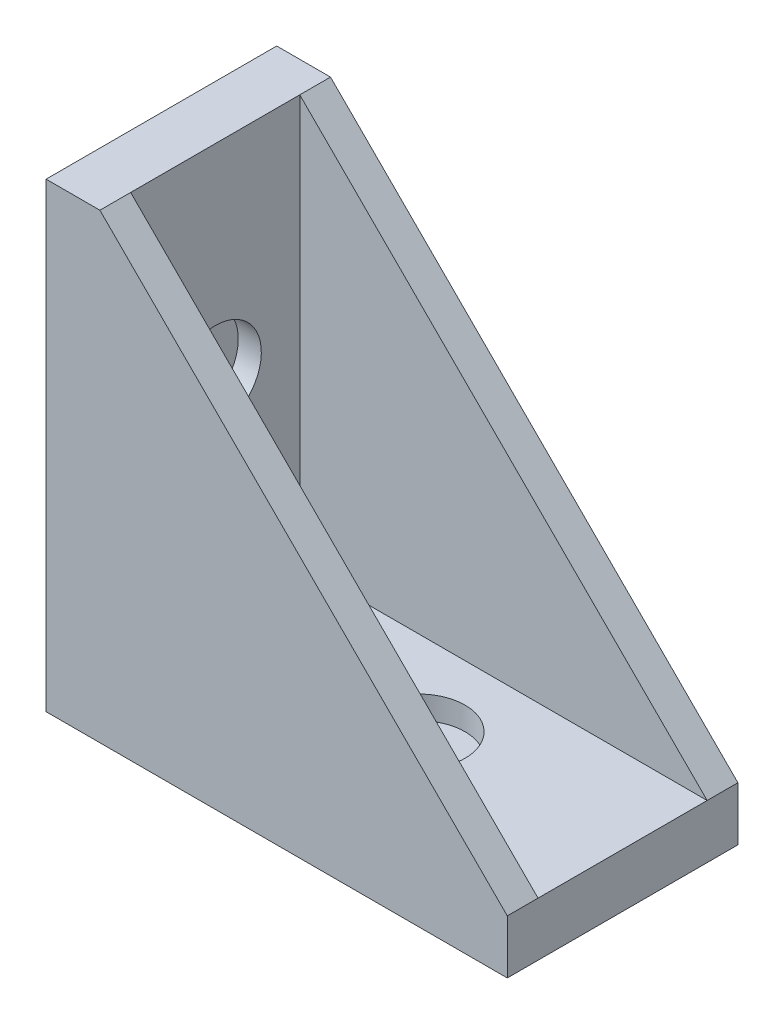
ISO-10303-21;
HEADER;
FILE_DESCRIPTION(('STEP AP214'),'2;1');
FILE_NAME('part.step','',(''),(''),'','','');
FILE_SCHEMA(('AUTOMOTIVE_DESIGN { 1 0 10303 214 1 1 1 1 }'));
ENDSEC;
DATA;
#1=APPLICATION_CONTEXT('core data for automotive mechanical design processes');
#2=APPLICATION_PROTOCOL_DEFINITION('international standard','automotive_design',2000,#1);
#3=PRODUCT_CONTEXT('',#1,'mechanical');
#4=PRODUCT('Part','Part','',(#3));
#5=PRODUCT_RELATED_PRODUCT_CATEGORY('part','',(#4));
#6=PRODUCT_DEFINITION_FORMATION('','',#4);
#7=PRODUCT_DEFINITION_CONTEXT('part definition',#1,'design');
#8=PRODUCT_DEFINITION('design','',#6,#7);
#9=PRODUCT_DEFINITION_SHAPE('','',#8);
#10=(LENGTH_UNIT() NAMED_UNIT(*) SI_UNIT(.MILLI.,.METRE.));
#11=(NAMED_UNIT(*) PLANE_ANGLE_UNIT() SI_UNIT($,.RADIAN.));
#12=(NAMED_UNIT(*) SI_UNIT($,.STERADIAN.) SOLID_ANGLE_UNIT());
#13=UNCERTAINTY_MEASURE_WITH_UNIT(LENGTH_MEASURE(1.E-05),#10,'distance_accuracy_value','');
#14=(GEOMETRIC_REPRESENTATION_CONTEXT(3) GLOBAL_UNCERTAINTY_ASSIGNED_CONTEXT((#13)) GLOBAL_UNIT_ASSIGNED_CONTEXT((#10,
#11,#12)) REPRESENTATION_CONTEXT('',''));
#15=CARTESIAN_POINT('',(0.,0.,0.));
#16=DIRECTION('',(0.,0.,1.));
#17=DIRECTION('',(1.,0.,0.));
#18=AXIS2_PLACEMENT_3D('',#15,#16,#17);
#19=CARTESIAN_POINT('',(-8.61103772744536,0.0697183422744274,-11.));
#20=DIRECTION('',(-1.,0.,0.));
#21=DIRECTION('',(0.,-1.,0.));
#22=AXIS2_PLACEMENT_3D('',#19,#20,#21);
#23=PLANE('',#22);
#24=DIRECTION('',(0.,-1.,0.));
#25=VECTOR('',#24,1.);
#26=CARTESIAN_POINT('',(-8.61103772744536,0.0697183422744274,0.));
#27=LINE('',#26,#25);
#28=CARTESIAN_POINT('',(-8.61103772744537,21.2977885735324,0.));
#29=VERTEX_POINT('',#28);
#30=CARTESIAN_POINT('',(-8.61103772744536,-5.20221142646766,0.));
#31=VERTEX_POINT('',#30);
#32=EDGE_CURVE('E55',#29,#31,#27,.T.);
#33=ORIENTED_EDGE('',*,*,#32,.T.);
#34=DIRECTION('',(0.,0.,1.));
#35=VECTOR('',#34,1.);
#36=CARTESIAN_POINT('',(-8.61103772744536,-5.20221142646766,-11.));
#37=LINE('',#36,#35);
#38=CARTESIAN_POINT('',(-8.61103772744536,-5.20221142646766,-11.));
#39=VERTEX_POINT('',#38);
#40=EDGE_CURVE('E145',#39,#31,#37,.T.);
#41=ORIENTED_EDGE('',*,*,#40,.F.);
#42=DIRECTION('',(0.,-1.,0.));
#43=VECTOR('',#42,1.);
#44=CARTESIAN_POINT('',(-8.61103772744536,0.0697183422744274,-11.));
#45=LINE('',#44,#43);
#46=CARTESIAN_POINT('',(-8.61103772744537,21.2977885735324,-11.));
#47=VERTEX_POINT('',#46);
#48=EDGE_CURVE('E143',#47,#39,#45,.T.);
#49=ORIENTED_EDGE('',*,*,#48,.F.);
#50=DIRECTION('',(0.,0.,1.));
#51=VECTOR('',#50,1.);
#52=CARTESIAN_POINT('',(-8.61103772744537,21.2977885735324,-11.));
#53=LINE('',#52,#51);
#54=EDGE_CURVE('E69',#47,#29,#53,.T.);
#55=ORIENTED_EDGE('',*,*,#54,.T.);
#56=EDGE_LOOP('',(#33,#41,#49,#55));
#57=FACE_BOUND('',#56,.T.);
#58=CARTESIAN_POINT('',(-8.61103772744536,8.04778857353235,-5.5));
#59=DIRECTION('',(1.,0.,0.));
#60=DIRECTION('',(0.,1.,0.));
#61=AXIS2_PLACEMENT_3D('',#58,#59,#60);
#62=CIRCLE('',#61,3.);
#63=CARTESIAN_POINT('',(-8.61103772744536,11.0477885735323,-5.5));
#64=VERTEX_POINT('',#63);
#65=EDGE_CURVE('E222',#64,#64,#62,.T.);
#66=ORIENTED_EDGE('',*,*,#65,.F.);
#67=EDGE_LOOP('',(#66));
#68=FACE_BOUND('',#67,.T.);
#69=ADVANCED_FACE('F16',(#57,#68),#23,.F.);
#70=CARTESIAN_POINT('',(-2.11103772744537,-5.20221142646766,-11.));
#71=DIRECTION('',(0.,-1.,0.));
#72=DIRECTION('',(0.,0.,-1.));
#73=AXIS2_PLACEMENT_3D('',#70,#71,#72);
#74=PLANE('',#73);
#75=DIRECTION('',(1.,0.,0.));
#76=VECTOR('',#75,1.);
#77=CARTESIAN_POINT('',(-2.11103772744537,-5.20221142646766,0.));
#78=LINE('',#77,#76);
#79=CARTESIAN_POINT('',(17.8889622725547,-5.20221142646766,0.));
#80=VERTEX_POINT('',#79);
#81=EDGE_CURVE('E166',#31,#80,#78,.T.);
#82=ORIENTED_EDGE('',*,*,#81,.T.);
#83=DIRECTION('',(0.,0.,1.));
#84=VECTOR('',#83,1.);
#85=CARTESIAN_POINT('',(17.8889622725547,-5.20221142646766,-11.));
#86=LINE('',#85,#84);
#87=CARTESIAN_POINT('',(17.8889622725547,-5.20221142646766,-11.));
#88=VERTEX_POINT('',#87);
#89=EDGE_CURVE('E129',#88,#80,#86,.T.);
#90=ORIENTED_EDGE('',*,*,#89,.F.);
#91=DIRECTION('',(1.,0.,0.));
#92=VECTOR('',#91,1.);
#93=CARTESIAN_POINT('',(-2.11103772744537,-5.20221142646766,-11.));
#94=LINE('',#93,#92);
#95=EDGE_CURVE('E146',#39,#88,#94,.T.);
#96=ORIENTED_EDGE('',*,*,#95,.F.);
#97=ORIENTED_EDGE('',*,*,#40,.T.);
#98=EDGE_LOOP('',(#82,#90,#96,#97));
#99=FACE_BOUND('',#98,.T.);
#100=CARTESIAN_POINT('',(4.63896227255464,-5.20221142646766,-5.5));
#101=DIRECTION('',(0.,1.,0.));
#102=DIRECTION('',(-1.,0.,0.));
#103=AXIS2_PLACEMENT_3D('',#100,#101,#102);
#104=CIRCLE('',#103,3.);
#105=CARTESIAN_POINT('',(1.63896227255464,-5.20221142646766,-5.5));
#106=VERTEX_POINT('',#105);
#107=EDGE_CURVE('E206',#106,#106,#104,.T.);
#108=ORIENTED_EDGE('',*,*,#107,.F.);
#109=EDGE_LOOP('',(#108));
#110=FACE_BOUND('',#109,.T.);
#111=ADVANCED_FACE('F251',(#99,#110),#74,.F.);
#112=CARTESIAN_POINT('',(2.88896227255463,6.29778857353235,0.));
#113=DIRECTION('',(0.,0.,1.));
#114=DIRECTION('',(1.,0.,0.));
#115=AXIS2_PLACEMENT_3D('',#112,#113,#114);
#116=PLANE('',#115);
#117=ORIENTED_EDGE('',*,*,#81,.F.);
#118=ORIENTED_EDGE('',*,*,#32,.F.);
#119=DIRECTION('',(-0.707106781186548,0.707106781186548,0.));
#120=VECTOR('',#119,1.);
#121=CARTESIAN_POINT('',(4.63896227255464,8.04778857353235,0.));
#122=LINE('',#121,#120);
#123=EDGE_CURVE('E125',#80,#29,#122,.T.);
#124=ORIENTED_EDGE('',*,*,#123,.F.);
#125=EDGE_LOOP('',(#117,#118,#124));
#126=FACE_BOUND('',#125,.T.);
#127=ADVANCED_FACE('F257',(#126),#116,.F.);
#128=CARTESIAN_POINT('',(-10.5320903285774,21.2977885735324,2.));
#129=DIRECTION('',(0.,1.,0.));
#130=DIRECTION('',(0.,0.,1.));
#131=AXIS2_PLACEMENT_3D('',#128,#129,#130);
#132=PLANE('',#131);
#133=DIRECTION('',(0.,0.,-1.));
#134=VECTOR('',#133,1.);
#135=CARTESIAN_POINT('',(-8.61103772744537,21.2977885735324,2.));
#136=LINE('',#135,#134);
#137=CARTESIAN_POINT('',(-8.61103772744537,21.2977885735324,2.));
#138=VERTEX_POINT('',#137);
#139=EDGE_CURVE('E124',#138,#29,#136,.T.);
#140=ORIENTED_EDGE('',*,*,#139,.T.);
#141=ORIENTED_EDGE('',*,*,#54,.F.);
#142=DIRECTION('',(0.,0.,1.));
#143=VECTOR('',#142,1.);
#144=CARTESIAN_POINT('',(-8.61103772744537,21.2977885735324,-13.));
#145=LINE('',#144,#143);
#146=CARTESIAN_POINT('',(-8.61103772744537,21.2977885735324,-13.));
#147=VERTEX_POINT('',#146);
#148=EDGE_CURVE('E167',#147,#47,#145,.T.);
#149=ORIENTED_EDGE('',*,*,#148,.F.);
#150=DIRECTION('',(1.,0.,0.));
#151=VECTOR('',#150,1.);
#152=CARTESIAN_POINT('',(-10.5320903285774,21.2977885735324,-13.));
#153=LINE('',#152,#151);
#154=CARTESIAN_POINT('',(-12.1110377274454,21.2977885735324,-13.));
#155=VERTEX_POINT('',#154);
#156=EDGE_CURVE('E193',#155,#147,#153,.T.);
#157=ORIENTED_EDGE('',*,*,#156,.F.);
#158=DIRECTION('',(0.,0.,-1.));
#159=VECTOR('',#158,1.);
#160=CARTESIAN_POINT('',(-12.1110377274454,21.2977885735324,2.));
#161=LINE('',#160,#159);
#162=CARTESIAN_POINT('',(-12.1110377274454,21.2977885735324,2.));
#163=VERTEX_POINT('',#162);
#164=EDGE_CURVE('E10',#163,#155,#161,.T.);
#165=ORIENTED_EDGE('',*,*,#164,.F.);
#166=DIRECTION('',(1.,0.,0.));
#167=VECTOR('',#166,1.);
#168=CARTESIAN_POINT('',(-10.5320903285774,21.2977885735324,2.));
#169=LINE('',#168,#167);
#170=EDGE_CURVE('E97',#163,#138,#169,.T.);
#171=ORIENTED_EDGE('',*,*,#170,.T.);
#172=EDGE_LOOP('',(#140,#141,#149,#157,#165,#171));
#173=FACE_BOUND('',#172,.T.);
#174=ADVANCED_FACE('F18',(#173),#132,.T.);
#175=CARTESIAN_POINT('',(-12.1110377274454,0.0697183422744274,2.));
#176=DIRECTION('',(1.,0.,0.));
#177=DIRECTION('',(0.,0.,-1.));
#178=AXIS2_PLACEMENT_3D('',#175,#176,#177);
#179=PLANE('',#178);
#180=CARTESIAN_POINT('',(-12.1110377274363,8.04778857353235,-5.5));
#181=DIRECTION('',(1.,0.,0.));
#182=DIRECTION('',(0.,0.,-1.));
#183=AXIS2_PLACEMENT_3D('',#180,#181,#182);
#184=CIRCLE('',#183,1.65);
#185=CARTESIAN_POINT('',(-12.1110377274363,8.04778857353235,-7.15));
#186=VERTEX_POINT('',#185);
#187=EDGE_CURVE('E211',#186,#186,#184,.F.);
#188=ORIENTED_EDGE('',*,*,#187,.F.);
#189=EDGE_LOOP('',(#188));
#190=FACE_BOUND('',#189,.T.);
#191=ORIENTED_EDGE('',*,*,#164,.T.);
#192=DIRECTION('',(0.,-1.,0.));
#193=VECTOR('',#192,1.);
#194=CARTESIAN_POINT('',(-12.1110377274454,0.0697183422744274,-13.));
#195=LINE('',#194,#193);
#196=CARTESIAN_POINT('',(-12.1110377274454,-8.70221142646765,-13.));
#197=VERTEX_POINT('',#196);
#198=EDGE_CURVE('E105',#155,#197,#195,.T.);
#199=ORIENTED_EDGE('',*,*,#198,.T.);
#200=DIRECTION('',(0.,0.,-1.));
#201=VECTOR('',#200,1.);
#202=CARTESIAN_POINT('',(-12.1110377274454,-8.70221142646765,2.));
#203=LINE('',#202,#201);
#204=CARTESIAN_POINT('',(-12.1110377274454,-8.70221142646765,2.));
#205=VERTEX_POINT('',#204);
#206=EDGE_CURVE('E26',#205,#197,#203,.T.);
#207=ORIENTED_EDGE('',*,*,#206,.F.);
#208=DIRECTION('',(0.,-1.,0.));
#209=VECTOR('',#208,1.);
#210=CARTESIAN_POINT('',(-12.1110377274454,0.0697183422744274,2.));
#211=LINE('',#210,#209);
#212=EDGE_CURVE('E90',#163,#205,#211,.T.);
#213=ORIENTED_EDGE('',*,*,#212,.F.);
#214=EDGE_LOOP('',(#191,#199,#207,#213));
#215=FACE_BOUND('',#214,.T.);
#216=ADVANCED_FACE('F103',(#190,#215),#179,.F.);
#217=CARTESIAN_POINT('',(-2.11103772744537,-8.70221142646765,2.));
#218=DIRECTION('',(0.,1.,0.));
#219=DIRECTION('',(0.,0.,1.));
#220=AXIS2_PLACEMENT_3D('',#217,#218,#219);
#221=PLANE('',#220);
#222=CARTESIAN_POINT('',(4.63896227255464,-8.70221142645278,-5.5));
#223=DIRECTION('',(0.,1.,0.));
#224=DIRECTION('',(0.,0.,1.));
#225=AXIS2_PLACEMENT_3D('',#222,#223,#224);
#226=CIRCLE('',#225,1.65);
#227=CARTESIAN_POINT('',(4.63896227255464,-8.70221142645278,-3.85));
#228=VERTEX_POINT('',#227);
#229=EDGE_CURVE('E186',#228,#228,#226,.F.);
#230=ORIENTED_EDGE('',*,*,#229,.F.);
#231=EDGE_LOOP('',(#230));
#232=FACE_BOUND('',#231,.T.);
#233=ORIENTED_EDGE('',*,*,#206,.T.);
#234=DIRECTION('',(1.,0.,0.));
#235=VECTOR('',#234,1.);
#236=CARTESIAN_POINT('',(-2.11103772744537,-8.70221142646765,-13.));
#237=LINE('',#236,#235);
#238=CARTESIAN_POINT('',(17.8889622725547,-8.70221142646765,-13.));
#239=VERTEX_POINT('',#238);
#240=EDGE_CURVE('E180',#197,#239,#237,.T.);
#241=ORIENTED_EDGE('',*,*,#240,.T.);
#242=DIRECTION('',(0.,0.,-1.));
#243=VECTOR('',#242,1.);
#244=CARTESIAN_POINT('',(17.8889622725547,-8.70221142646765,2.));
#245=LINE('',#244,#243);
#246=CARTESIAN_POINT('',(17.8889622725547,-8.70221142646765,2.));
#247=VERTEX_POINT('',#246);
#248=EDGE_CURVE('E110',#247,#239,#245,.T.);
#249=ORIENTED_EDGE('',*,*,#248,.F.);
#250=DIRECTION('',(1.,0.,0.));
#251=VECTOR('',#250,1.);
#252=CARTESIAN_POINT('',(-2.11103772744537,-8.70221142646765,2.));
#253=LINE('',#252,#251);
#254=EDGE_CURVE('E94',#205,#247,#253,.T.);
#255=ORIENTED_EDGE('',*,*,#254,.F.);
#256=EDGE_LOOP('',(#233,#241,#249,#255));
#257=FACE_BOUND('',#256,.T.);
#258=ADVANCED_FACE('F112',(#232,#257),#221,.F.);
#259=CARTESIAN_POINT('',(17.8889622725547,-7.47414119520973,2.));
#260=DIRECTION('',(-1.,0.,0.));
#261=DIRECTION('',(0.,-1.,0.));
#262=AXIS2_PLACEMENT_3D('',#259,#260,#261);
#263=PLANE('',#262);
#264=ORIENTED_EDGE('',*,*,#248,.T.);
#265=DIRECTION('',(0.,1.,0.));
#266=VECTOR('',#265,1.);
#267=CARTESIAN_POINT('',(17.8889622725547,-7.47414119520973,-13.));
#268=LINE('',#267,#266);
#269=CARTESIAN_POINT('',(17.8889622725547,-5.20221142646766,-13.));
#270=VERTEX_POINT('',#269);
#271=EDGE_CURVE('E189',#239,#270,#268,.T.);
#272=ORIENTED_EDGE('',*,*,#271,.T.);
#273=DIRECTION('',(0.,0.,1.));
#274=VECTOR('',#273,1.);
#275=CARTESIAN_POINT('',(17.8889622725547,-5.20221142646766,-13.));
#276=LINE('',#275,#274);
#277=EDGE_CURVE('E176',#270,#88,#276,.T.);
#278=ORIENTED_EDGE('',*,*,#277,.T.);
#279=ORIENTED_EDGE('',*,*,#89,.T.);
#280=DIRECTION('',(0.,0.,-1.));
#281=VECTOR('',#280,1.);
#282=CARTESIAN_POINT('',(17.8889622725547,-5.20221142646766,2.));
#283=LINE('',#282,#281);
#284=CARTESIAN_POINT('',(17.8889622725547,-5.20221142646766,2.));
#285=VERTEX_POINT('',#284);
#286=EDGE_CURVE('E130',#285,#80,#283,.T.);
#287=ORIENTED_EDGE('',*,*,#286,.F.);
#288=DIRECTION('',(0.,1.,0.));
#289=VECTOR('',#288,1.);
#290=CARTESIAN_POINT('',(17.8889622725547,-7.47414119520973,2.));
#291=LINE('',#290,#289);
#292=EDGE_CURVE('E39',#247,#285,#291,.T.);
#293=ORIENTED_EDGE('',*,*,#292,.F.);
#294=EDGE_LOOP('',(#264,#272,#278,#279,#287,#293));
#295=FACE_BOUND('',#294,.T.);
#296=ADVANCED_FACE('F269',(#295),#263,.F.);
#297=CARTESIAN_POINT('',(4.63896227255464,8.04778857353235,2.));
#298=DIRECTION('',(-0.707106781186548,-0.707106781186548,0.));
#299=DIRECTION('',(0.707106781186548,-0.707106781186548,0.));
#300=AXIS2_PLACEMENT_3D('',#297,#298,#299);
#301=PLANE('',#300);
#302=ORIENTED_EDGE('',*,*,#123,.T.);
#303=ORIENTED_EDGE('',*,*,#139,.F.);
#304=DIRECTION('',(-0.707106781186548,0.707106781186548,0.));
#305=VECTOR('',#304,1.);
#306=CARTESIAN_POINT('',(4.63896227255464,8.04778857353235,2.));
#307=LINE('',#306,#305);
#308=EDGE_CURVE('E118',#285,#138,#307,.T.);
#309=ORIENTED_EDGE('',*,*,#308,.F.);
#310=ORIENTED_EDGE('',*,*,#286,.T.);
#311=EDGE_LOOP('',(#302,#303,#309,#310));
#312=FACE_BOUND('',#311,.T.);
#313=ADVANCED_FACE('F138',(#312),#301,.F.);
#314=CARTESIAN_POINT('',(2.88896227255463,6.29778857353235,2.));
#315=DIRECTION('',(0.,0.,1.));
#316=DIRECTION('',(1.,0.,0.));
#317=AXIS2_PLACEMENT_3D('',#314,#315,#316);
#318=PLANE('',#317);
#319=ORIENTED_EDGE('',*,*,#170,.F.);
#320=ORIENTED_EDGE('',*,*,#212,.T.);
#321=ORIENTED_EDGE('',*,*,#254,.T.);
#322=ORIENTED_EDGE('',*,*,#292,.T.);
#323=ORIENTED_EDGE('',*,*,#308,.T.);
#324=EDGE_LOOP('',(#319,#320,#321,#322,#323));
#325=FACE_BOUND('',#324,.T.);
#326=ADVANCED_FACE('F92',(#325),#318,.T.);
#327=CARTESIAN_POINT('',(2.88896227255464,6.29778857353235,-11.));
#328=DIRECTION('',(0.,0.,-1.));
#329=DIRECTION('',(1.,0.,0.));
#330=AXIS2_PLACEMENT_3D('',#327,#328,#329);
#331=PLANE('',#330);
#332=DIRECTION('',(0.707106781186548,-0.707106781186548,0.));
#333=VECTOR('',#332,1.);
#334=CARTESIAN_POINT('',(4.63896227255464,8.04778857353234,-11.));
#335=LINE('',#334,#333);
#336=EDGE_CURVE('E181',#47,#88,#335,.T.);
#337=ORIENTED_EDGE('',*,*,#336,.F.);
#338=ORIENTED_EDGE('',*,*,#48,.T.);
#339=ORIENTED_EDGE('',*,*,#95,.T.);
#340=EDGE_LOOP('',(#337,#338,#339));
#341=FACE_BOUND('',#340,.T.);
#342=ADVANCED_FACE('F264',(#341),#331,.F.);
#343=CARTESIAN_POINT('',(4.63896227255464,8.04778857353234,-13.));
#344=DIRECTION('',(-0.707106781186548,-0.707106781186548,0.));
#345=DIRECTION('',(0.707106781186548,-0.707106781186548,0.));
#346=AXIS2_PLACEMENT_3D('',#343,#344,#345);
#347=PLANE('',#346);
#348=ORIENTED_EDGE('',*,*,#336,.T.);
#349=ORIENTED_EDGE('',*,*,#277,.F.);
#350=DIRECTION('',(0.707106781186548,-0.707106781186548,0.));
#351=VECTOR('',#350,1.);
#352=CARTESIAN_POINT('',(4.63896227255464,8.04778857353234,-13.));
#353=LINE('',#352,#351);
#354=EDGE_CURVE('E185',#147,#270,#353,.T.);
#355=ORIENTED_EDGE('',*,*,#354,.F.);
#356=ORIENTED_EDGE('',*,*,#148,.T.);
#357=EDGE_LOOP('',(#348,#349,#355,#356));
#358=FACE_BOUND('',#357,.T.);
#359=ADVANCED_FACE('F301',(#358),#347,.F.);
#360=CARTESIAN_POINT('',(2.88896227255464,6.29778857353235,-13.));
#361=DIRECTION('',(0.,0.,-1.));
#362=DIRECTION('',(1.,0.,0.));
#363=AXIS2_PLACEMENT_3D('',#360,#361,#362);
#364=PLANE('',#363);
#365=ORIENTED_EDGE('',*,*,#156,.T.);
#366=ORIENTED_EDGE('',*,*,#354,.T.);
#367=ORIENTED_EDGE('',*,*,#271,.F.);
#368=ORIENTED_EDGE('',*,*,#240,.F.);
#369=ORIENTED_EDGE('',*,*,#198,.F.);
#370=EDGE_LOOP('',(#365,#366,#367,#368,#369));
#371=FACE_BOUND('',#370,.T.);
#372=ADVANCED_FACE('F297',(#371),#364,.T.);
#373=CARTESIAN_POINT('',(4.63896227255464,-500000.,-5.5));
#374=DIRECTION('',(0.,1.,0.));
#375=DIRECTION('',(0.,0.,1.));
#376=AXIS2_PLACEMENT_3D('',#373,#374,#375);
#377=CYLINDRICAL_SURFACE('',#376,1.65);
#378=CARTESIAN_POINT('',(4.63896227255464,-6.70221142646765,-5.5));
#379=DIRECTION('',(0.,1.,0.));
#380=DIRECTION('',(-1.,0.,0.));
#381=AXIS2_PLACEMENT_3D('',#378,#379,#380);
#382=CIRCLE('',#381,1.65);
#383=CARTESIAN_POINT('',(2.98896227255464,-6.70221142646765,-5.5));
#384=VERTEX_POINT('',#383);
#385=EDGE_CURVE('E210',#384,#384,#382,.T.);
#386=ORIENTED_EDGE('',*,*,#385,.T.);
#387=EDGE_LOOP('',(#386));
#388=FACE_BOUND('',#387,.T.);
#389=ORIENTED_EDGE('',*,*,#229,.T.);
#390=EDGE_LOOP('',(#389));
#391=FACE_BOUND('',#390,.T.);
#392=ADVANCED_FACE('F293',(#388,#391),#377,.F.);
#393=CARTESIAN_POINT('',(4.63896227255464,-6.70221142646765,-5.5));
#394=DIRECTION('',(0.,1.,0.));
#395=DIRECTION('',(0.,0.,1.));
#396=AXIS2_PLACEMENT_3D('',#393,#394,#395);
#397=CYLINDRICAL_SURFACE('',#396,3.);
#398=CARTESIAN_POINT('',(4.63896227255464,-6.70221142646765,-5.5));
#399=DIRECTION('',(0.,1.,0.));
#400=DIRECTION('',(-1.,0.,0.));
#401=AXIS2_PLACEMENT_3D('',#398,#399,#400);
#402=CIRCLE('',#401,3.);
#403=CARTESIAN_POINT('',(1.63896227255464,-6.70221142646765,-5.5));
#404=VERTEX_POINT('',#403);
#405=EDGE_CURVE('E205',#404,#404,#402,.T.);
#406=ORIENTED_EDGE('',*,*,#405,.F.);
#407=EDGE_LOOP('',(#406));
#408=FACE_BOUND('',#407,.T.);
#409=ORIENTED_EDGE('',*,*,#107,.T.);
#410=EDGE_LOOP('',(#409));
#411=FACE_BOUND('',#410,.T.);
#412=ADVANCED_FACE('F287',(#408,#411),#397,.F.);
#413=CARTESIAN_POINT('',(4.63896227255464,-6.70221142646765,-5.5));
#414=DIRECTION('',(0.,1.,0.));
#415=DIRECTION('',(-1.,0.,0.));
#416=AXIS2_PLACEMENT_3D('',#413,#414,#415);
#417=PLANE('',#416);
#418=ORIENTED_EDGE('',*,*,#385,.F.);
#419=EDGE_LOOP('',(#418));
#420=FACE_BOUND('',#419,.T.);
#421=ORIENTED_EDGE('',*,*,#405,.T.);
#422=EDGE_LOOP('',(#421));
#423=FACE_BOUND('',#422,.T.);
#424=ADVANCED_FACE('F282',(#420,#423),#417,.T.);
#425=CARTESIAN_POINT('',(-500000.,8.04778857350173,-5.5));
#426=DIRECTION('',(1.,0.,0.));
#427=DIRECTION('',(0.,1.,0.));
#428=AXIS2_PLACEMENT_3D('',#425,#426,#427);
#429=CYLINDRICAL_SURFACE('',#428,1.65);
#430=CARTESIAN_POINT('',(-10.1110377274454,8.04778857353235,-5.5));
#431=DIRECTION('',(1.,0.,0.));
#432=DIRECTION('',(0.,1.,0.));
#433=AXIS2_PLACEMENT_3D('',#430,#431,#432);
#434=CIRCLE('',#433,1.65);
#435=CARTESIAN_POINT('',(-10.1110377274454,9.69778857353235,-5.5));
#436=VERTEX_POINT('',#435);
#437=EDGE_CURVE('E226',#436,#436,#434,.T.);
#438=ORIENTED_EDGE('',*,*,#437,.T.);
#439=EDGE_LOOP('',(#438));
#440=FACE_BOUND('',#439,.T.);
#441=ORIENTED_EDGE('',*,*,#187,.T.);
#442=EDGE_LOOP('',(#441));
#443=FACE_BOUND('',#442,.T.);
#444=ADVANCED_FACE('F236',(#440,#443),#429,.F.);
#445=CARTESIAN_POINT('',(-10.1110377274454,8.04778857353235,-5.5));
#446=DIRECTION('',(1.,0.,0.));
#447=DIRECTION('',(0.,1.,0.));
#448=AXIS2_PLACEMENT_3D('',#445,#446,#447);
#449=CYLINDRICAL_SURFACE('',#448,3.);
#450=CARTESIAN_POINT('',(-10.1110377274454,8.04778857353235,-5.5));
#451=DIRECTION('',(1.,0.,0.));
#452=DIRECTION('',(0.,1.,0.));
#453=AXIS2_PLACEMENT_3D('',#450,#451,#452);
#454=CIRCLE('',#453,3.);
#455=CARTESIAN_POINT('',(-10.1110377274454,11.0477885735323,-5.5));
#456=VERTEX_POINT('',#455);
#457=EDGE_CURVE('E221',#456,#456,#454,.T.);
#458=ORIENTED_EDGE('',*,*,#457,.F.);
#459=EDGE_LOOP('',(#458));
#460=FACE_BOUND('',#459,.T.);
#461=ORIENTED_EDGE('',*,*,#65,.T.);
#462=EDGE_LOOP('',(#461));
#463=FACE_BOUND('',#462,.T.);
#464=ADVANCED_FACE('F242',(#460,#463),#449,.F.);
#465=CARTESIAN_POINT('',(-10.1110377274454,8.04778857353235,-5.5));
#466=DIRECTION('',(1.,0.,0.));
#467=DIRECTION('',(0.,1.,0.));
#468=AXIS2_PLACEMENT_3D('',#465,#466,#467);
#469=PLANE('',#468);
#470=ORIENTED_EDGE('',*,*,#437,.F.);
#471=EDGE_LOOP('',(#470));
#472=FACE_BOUND('',#471,.T.);
#473=ORIENTED_EDGE('',*,*,#457,.T.);
#474=EDGE_LOOP('',(#473));
#475=FACE_BOUND('',#474,.T.);
#476=ADVANCED_FACE('F239',(#472,#475),#469,.T.);
#477=CLOSED_SHELL('',(#69,#111,#127,#174,#216,#258,#296,#313,#326,#342,#359,#372,#392,#412,#424,
#444,#464,#476));
#478=MANIFOLD_SOLID_BREP('B1',#477);
#479=ADVANCED_BREP_SHAPE_REPRESENTATION('',(#18,#478),#14);
#480=SHAPE_DEFINITION_REPRESENTATION(#9,#479);
ENDSEC;
END-ISO-10303-21;
